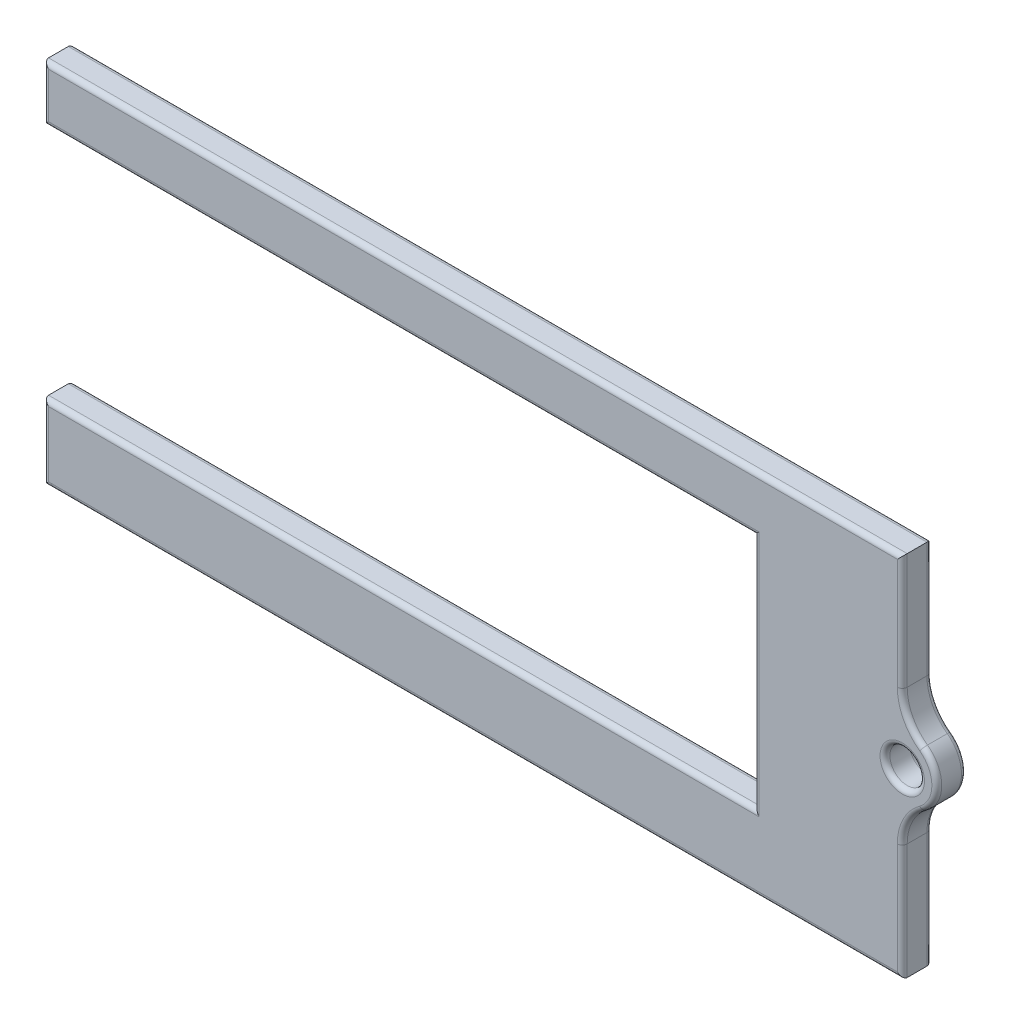
ISO-10303-21;
HEADER;
FILE_DESCRIPTION(('STEP AP214'),'2;1');
FILE_NAME('part.step','',(''),(''),'','','');
FILE_SCHEMA(('AUTOMOTIVE_DESIGN { 1 0 10303 214 1 1 1 1 }'));
ENDSEC;
DATA;
#1=APPLICATION_CONTEXT('core data for automotive mechanical design processes');
#2=APPLICATION_PROTOCOL_DEFINITION('international standard','automotive_design',2000,#1);
#3=PRODUCT_CONTEXT('',#1,'mechanical');
#4=PRODUCT('Part','Part','',(#3));
#5=PRODUCT_RELATED_PRODUCT_CATEGORY('part','',(#4));
#6=PRODUCT_DEFINITION_FORMATION('','',#4);
#7=PRODUCT_DEFINITION_CONTEXT('part definition',#1,'design');
#8=PRODUCT_DEFINITION('design','',#6,#7);
#9=PRODUCT_DEFINITION_SHAPE('','',#8);
#10=(LENGTH_UNIT() NAMED_UNIT(*) SI_UNIT(.MILLI.,.METRE.));
#11=(NAMED_UNIT(*) PLANE_ANGLE_UNIT() SI_UNIT($,.RADIAN.));
#12=(NAMED_UNIT(*) SI_UNIT($,.STERADIAN.) SOLID_ANGLE_UNIT());
#13=UNCERTAINTY_MEASURE_WITH_UNIT(LENGTH_MEASURE(1.E-05),#10,'distance_accuracy_value','');
#14=(GEOMETRIC_REPRESENTATION_CONTEXT(3) GLOBAL_UNCERTAINTY_ASSIGNED_CONTEXT((#13)) GLOBAL_UNIT_ASSIGNED_CONTEXT((#10,
#11,#12)) REPRESENTATION_CONTEXT('',''));
#15=CARTESIAN_POINT('',(0.,0.,0.));
#16=DIRECTION('',(0.,0.,1.));
#17=DIRECTION('',(1.,0.,0.));
#18=AXIS2_PLACEMENT_3D('',#15,#16,#17);
#19=CARTESIAN_POINT('',(-179.5,121.,3.));
#20=DIRECTION('',(0.,0.,1.));
#21=DIRECTION('',(1.,0.,0.));
#22=AXIS2_PLACEMENT_3D('',#19,#20,#21);
#23=PLANE('',#22);
#24=CARTESIAN_POINT('',(-179.5,121.,3.));
#25=DIRECTION('',(0.,0.,1.));
#26=DIRECTION('',(1.,0.,0.));
#27=AXIS2_PLACEMENT_3D('',#24,#25,#26);
#28=CIRCLE('',#27,2.25000000000001);
#29=CARTESIAN_POINT('',(-177.25,121.,3.));
#30=VERTEX_POINT('',#29);
#31=EDGE_CURVE('E11',#30,#30,#28,.F.);
#32=ORIENTED_EDGE('',*,*,#31,.T.);
#33=EDGE_LOOP('',(#32));
#34=FACE_BOUND('',#33,.T.);
#35=DIRECTION('',(0.,1.,0.));
#36=VECTOR('',#35,1.);
#37=CARTESIAN_POINT('',(-180.,114.126136457566,3.));
#38=LINE('',#37,#36);
#39=CARTESIAN_POINT('',(-180.,102.9,3.));
#40=VERTEX_POINT('',#39);
#41=CARTESIAN_POINT('',(-180.,114.126136457566,3.));
#42=VERTEX_POINT('',#41);
#43=EDGE_CURVE('E60',#40,#42,#38,.T.);
#44=ORIENTED_EDGE('',*,*,#43,.T.);
#45=CARTESIAN_POINT('',(-174.5,114.126136457566,3.));
#46=DIRECTION('',(0.,0.,1.));
#47=DIRECTION('',(1.,0.,0.));
#48=AXIS2_PLACEMENT_3D('',#45,#46,#47);
#49=CIRCLE('',#48,5.50000000000001);
#50=CARTESIAN_POINT('',(-177.735294117647,118.573930514435,3.));
#51=VERTEX_POINT('',#50);
#52=EDGE_CURVE('E52',#42,#51,#49,.F.);
#53=ORIENTED_EDGE('',*,*,#52,.T.);
#54=CARTESIAN_POINT('',(-179.5,121.,3.));
#55=DIRECTION('',(0.,0.,1.));
#56=DIRECTION('',(1.,0.,0.));
#57=AXIS2_PLACEMENT_3D('',#54,#55,#56);
#58=CIRCLE('',#57,2.99999999999999);
#59=CARTESIAN_POINT('',(-177.735294117647,123.426069485565,3.));
#60=VERTEX_POINT('',#59);
#61=EDGE_CURVE('E326',#51,#60,#58,.T.);
#62=ORIENTED_EDGE('',*,*,#61,.T.);
#63=CARTESIAN_POINT('',(-174.5,127.873863542434,3.));
#64=DIRECTION('',(0.,0.,1.));
#65=DIRECTION('',(1.,0.,0.));
#66=AXIS2_PLACEMENT_3D('',#63,#64,#65);
#67=CIRCLE('',#66,5.50000000000001);
#68=CARTESIAN_POINT('',(-180.,127.873863542434,3.));
#69=VERTEX_POINT('',#68);
#70=EDGE_CURVE('E329',#60,#69,#67,.F.);
#71=ORIENTED_EDGE('',*,*,#70,.T.);
#72=DIRECTION('',(0.,1.,0.));
#73=VECTOR('',#72,1.);
#74=CARTESIAN_POINT('',(-180.,139.6,3.));
#75=LINE('',#74,#73);
#76=CARTESIAN_POINT('',(-180.,139.1,3.));
#77=VERTEX_POINT('',#76);
#78=EDGE_CURVE('E332',#69,#77,#75,.T.);
#79=ORIENTED_EDGE('',*,*,#78,.T.);
#80=DIRECTION('',(-1.,0.,0.));
#81=VECTOR('',#80,1.);
#82=CARTESIAN_POINT('',(-266.5,139.1,3.));
#83=LINE('',#82,#81);
#84=CARTESIAN_POINT('',(-266.,139.1,3.));
#85=VERTEX_POINT('',#84);
#86=EDGE_CURVE('E335',#77,#85,#83,.T.);
#87=ORIENTED_EDGE('',*,*,#86,.T.);
#88=DIRECTION('',(0.,-1.,0.));
#89=VECTOR('',#88,1.);
#90=CARTESIAN_POINT('',(-266.,134.,3.));
#91=LINE('',#90,#89);
#92=CARTESIAN_POINT('',(-266.,134.5,3.));
#93=VERTEX_POINT('',#92);
#94=EDGE_CURVE('E338',#85,#93,#91,.T.);
#95=ORIENTED_EDGE('',*,*,#94,.T.);
#96=DIRECTION('',(1.,0.,0.));
#97=VECTOR('',#96,1.);
#98=CARTESIAN_POINT('',(-194.5,134.5,3.));
#99=LINE('',#98,#97);
#100=CARTESIAN_POINT('',(-194.,134.5,3.));
#101=VERTEX_POINT('',#100);
#102=EDGE_CURVE('E341',#93,#101,#99,.T.);
#103=ORIENTED_EDGE('',*,*,#102,.T.);
#104=DIRECTION('',(0.,-1.,0.));
#105=VECTOR('',#104,1.);
#106=CARTESIAN_POINT('',(-194.,110.,3.));
#107=LINE('',#106,#105);
#108=CARTESIAN_POINT('',(-194.,109.5,3.));
#109=VERTEX_POINT('',#108);
#110=EDGE_CURVE('E344',#101,#109,#107,.T.);
#111=ORIENTED_EDGE('',*,*,#110,.T.);
#112=DIRECTION('',(-1.,0.,0.));
#113=VECTOR('',#112,1.);
#114=CARTESIAN_POINT('',(-266.5,109.5,3.));
#115=LINE('',#114,#113);
#116=CARTESIAN_POINT('',(-266.,109.5,3.));
#117=VERTEX_POINT('',#116);
#118=EDGE_CURVE('E347',#109,#117,#115,.T.);
#119=ORIENTED_EDGE('',*,*,#118,.T.);
#120=DIRECTION('',(0.,-1.,0.));
#121=VECTOR('',#120,1.);
#122=CARTESIAN_POINT('',(-266.,102.4,3.));
#123=LINE('',#122,#121);
#124=CARTESIAN_POINT('',(-266.,102.9,3.));
#125=VERTEX_POINT('',#124);
#126=EDGE_CURVE('E350',#117,#125,#123,.T.);
#127=ORIENTED_EDGE('',*,*,#126,.T.);
#128=DIRECTION('',(1.,0.,0.));
#129=VECTOR('',#128,1.);
#130=CARTESIAN_POINT('',(-179.5,102.9,3.));
#131=LINE('',#130,#129);
#132=EDGE_CURVE('E65',#125,#40,#131,.T.);
#133=ORIENTED_EDGE('',*,*,#132,.T.);
#134=EDGE_LOOP('',(#44,#53,#62,#71,#79,#87,#95,#103,#111,#119,#127,#133));
#135=FACE_BOUND('',#134,.T.);
#136=ADVANCED_FACE('F42',(#34,#135),#23,.T.);
#137=CARTESIAN_POINT('',(-179.5,121.,0.));
#138=DIRECTION('',(0.,0.,1.));
#139=DIRECTION('',(1.,0.,0.));
#140=AXIS2_PLACEMENT_3D('',#137,#138,#139);
#141=PLANE('',#140);
#142=CARTESIAN_POINT('',(-179.5,121.,0.));
#143=DIRECTION('',(0.,0.,1.));
#144=DIRECTION('',(1.,0.,0.));
#145=AXIS2_PLACEMENT_3D('',#142,#143,#144);
#146=CIRCLE('',#145,2.25000000000001);
#147=CARTESIAN_POINT('',(-177.25,121.,0.));
#148=VERTEX_POINT('',#147);
#149=EDGE_CURVE('E236',#148,#148,#146,.T.);
#150=ORIENTED_EDGE('',*,*,#149,.T.);
#151=EDGE_LOOP('',(#150));
#152=FACE_BOUND('',#151,.T.);
#153=DIRECTION('',(0.,1.,0.));
#154=VECTOR('',#153,1.);
#155=CARTESIAN_POINT('',(-180.,121.,0.));
#156=LINE('',#155,#154);
#157=CARTESIAN_POINT('',(-180.,139.1,0.));
#158=VERTEX_POINT('',#157);
#159=CARTESIAN_POINT('',(-180.,127.873863542434,0.));
#160=VERTEX_POINT('',#159);
#161=EDGE_CURVE('E234',#158,#160,#156,.F.);
#162=ORIENTED_EDGE('',*,*,#161,.T.);
#163=CARTESIAN_POINT('',(-174.5,127.873863542434,0.));
#164=DIRECTION('',(0.,0.,1.));
#165=DIRECTION('',(1.,0.,0.));
#166=AXIS2_PLACEMENT_3D('',#163,#164,#165);
#167=CIRCLE('',#166,5.50000000000001);
#168=CARTESIAN_POINT('',(-177.735294117647,123.426069485565,0.));
#169=VERTEX_POINT('',#168);
#170=EDGE_CURVE('E211',#160,#169,#167,.T.);
#171=ORIENTED_EDGE('',*,*,#170,.T.);
#172=CARTESIAN_POINT('',(-179.5,121.,0.));
#173=DIRECTION('',(0.,0.,1.));
#174=DIRECTION('',(1.,0.,0.));
#175=AXIS2_PLACEMENT_3D('',#172,#173,#174);
#176=CIRCLE('',#175,2.99999999999999);
#177=CARTESIAN_POINT('',(-177.735294117647,118.573930514435,0.));
#178=VERTEX_POINT('',#177);
#179=EDGE_CURVE('E222',#169,#178,#176,.F.);
#180=ORIENTED_EDGE('',*,*,#179,.T.);
#181=CARTESIAN_POINT('',(-174.5,114.126136457566,0.));
#182=DIRECTION('',(0.,0.,1.));
#183=DIRECTION('',(1.,0.,0.));
#184=AXIS2_PLACEMENT_3D('',#181,#182,#183);
#185=CIRCLE('',#184,5.50000000000001);
#186=CARTESIAN_POINT('',(-180.,114.126136457566,0.));
#187=VERTEX_POINT('',#186);
#188=EDGE_CURVE('E229',#178,#187,#185,.T.);
#189=ORIENTED_EDGE('',*,*,#188,.T.);
#190=DIRECTION('',(0.,1.,0.));
#191=VECTOR('',#190,1.);
#192=CARTESIAN_POINT('',(-180.,121.,0.));
#193=LINE('',#192,#191);
#194=CARTESIAN_POINT('',(-180.,102.9,0.));
#195=VERTEX_POINT('',#194);
#196=EDGE_CURVE('E491',#187,#195,#193,.F.);
#197=ORIENTED_EDGE('',*,*,#196,.T.);
#198=DIRECTION('',(1.,0.,0.));
#199=VECTOR('',#198,1.);
#200=CARTESIAN_POINT('',(-179.5,102.9,0.));
#201=LINE('',#200,#199);
#202=CARTESIAN_POINT('',(-266.,102.9,0.));
#203=VERTEX_POINT('',#202);
#204=EDGE_CURVE('E494',#195,#203,#201,.F.);
#205=ORIENTED_EDGE('',*,*,#204,.T.);
#206=DIRECTION('',(0.,-1.,0.));
#207=VECTOR('',#206,1.);
#208=CARTESIAN_POINT('',(-266.,121.,0.));
#209=LINE('',#208,#207);
#210=CARTESIAN_POINT('',(-266.,109.5,0.));
#211=VERTEX_POINT('',#210);
#212=EDGE_CURVE('E497',#203,#211,#209,.F.);
#213=ORIENTED_EDGE('',*,*,#212,.T.);
#214=DIRECTION('',(-1.,0.,0.));
#215=VECTOR('',#214,1.);
#216=CARTESIAN_POINT('',(-179.5,109.5,0.));
#217=LINE('',#216,#215);
#218=CARTESIAN_POINT('',(-194.,109.5,0.));
#219=VERTEX_POINT('',#218);
#220=EDGE_CURVE('E500',#211,#219,#217,.F.);
#221=ORIENTED_EDGE('',*,*,#220,.T.);
#222=DIRECTION('',(0.,-1.,0.));
#223=VECTOR('',#222,1.);
#224=CARTESIAN_POINT('',(-194.,121.,0.));
#225=LINE('',#224,#223);
#226=CARTESIAN_POINT('',(-194.,134.5,0.));
#227=VERTEX_POINT('',#226);
#228=EDGE_CURVE('E503',#219,#227,#225,.F.);
#229=ORIENTED_EDGE('',*,*,#228,.T.);
#230=DIRECTION('',(1.,0.,0.));
#231=VECTOR('',#230,1.);
#232=CARTESIAN_POINT('',(-179.5,134.5,0.));
#233=LINE('',#232,#231);
#234=CARTESIAN_POINT('',(-266.,134.5,0.));
#235=VERTEX_POINT('',#234);
#236=EDGE_CURVE('E506',#227,#235,#233,.F.);
#237=ORIENTED_EDGE('',*,*,#236,.T.);
#238=DIRECTION('',(0.,-1.,0.));
#239=VECTOR('',#238,1.);
#240=CARTESIAN_POINT('',(-266.,121.,0.));
#241=LINE('',#240,#239);
#242=CARTESIAN_POINT('',(-266.,139.1,0.));
#243=VERTEX_POINT('',#242);
#244=EDGE_CURVE('E509',#235,#243,#241,.F.);
#245=ORIENTED_EDGE('',*,*,#244,.T.);
#246=DIRECTION('',(-1.,0.,0.));
#247=VECTOR('',#246,1.);
#248=CARTESIAN_POINT('',(-179.5,139.1,0.));
#249=LINE('',#248,#247);
#250=EDGE_CURVE('E243',#243,#158,#249,.F.);
#251=ORIENTED_EDGE('',*,*,#250,.T.);
#252=EDGE_LOOP('',(#162,#171,#180,#189,#197,#205,#213,#221,#229,#237,#245,#251));
#253=FACE_BOUND('',#252,.T.);
#254=ADVANCED_FACE('F232',(#152,#253),#141,.F.);
#255=CARTESIAN_POINT('',(-179.5,121.,3.));
#256=DIRECTION('',(0.,0.,-1.));
#257=DIRECTION('',(-1.,0.,0.));
#258=AXIS2_PLACEMENT_3D('',#255,#256,#257);
#259=CYLINDRICAL_SURFACE('',#258,3.49999999999999);
#260=DIRECTION('',(0.,0.,-1.));
#261=VECTOR('',#260,1.);
#262=CARTESIAN_POINT('',(-177.441176470588,118.169585600174,3.));
#263=LINE('',#262,#261);
#264=CARTESIAN_POINT('',(-177.441176470588,118.169585600174,2.5));
#265=VERTEX_POINT('',#264);
#266=CARTESIAN_POINT('',(-177.441176470588,118.169585600174,0.5));
#267=VERTEX_POINT('',#266);
#268=EDGE_CURVE('E398',#265,#267,#263,.T.);
#269=ORIENTED_EDGE('',*,*,#268,.T.);
#270=CARTESIAN_POINT('',(-179.5,121.,0.5));
#271=DIRECTION('',(0.,0.,1.));
#272=DIRECTION('',(1.,0.,0.));
#273=AXIS2_PLACEMENT_3D('',#270,#271,#272);
#274=CIRCLE('',#273,3.49999999999999);
#275=CARTESIAN_POINT('',(-177.441176470588,123.830414399826,0.5));
#276=VERTEX_POINT('',#275);
#277=EDGE_CURVE('E323',#267,#276,#274,.T.);
#278=ORIENTED_EDGE('',*,*,#277,.T.);
#279=DIRECTION('',(0.,0.,-1.));
#280=VECTOR('',#279,1.);
#281=CARTESIAN_POINT('',(-177.441176470588,123.830414399826,3.));
#282=LINE('',#281,#280);
#283=CARTESIAN_POINT('',(-177.441176470588,123.830414399826,2.5));
#284=VERTEX_POINT('',#283);
#285=EDGE_CURVE('E230',#284,#276,#282,.T.);
#286=ORIENTED_EDGE('',*,*,#285,.F.);
#287=CARTESIAN_POINT('',(-179.5,121.,2.5));
#288=DIRECTION('',(0.,0.,1.));
#289=DIRECTION('',(1.,0.,0.));
#290=AXIS2_PLACEMENT_3D('',#287,#288,#289);
#291=CIRCLE('',#290,3.49999999999999);
#292=EDGE_CURVE('E320',#284,#265,#291,.F.);
#293=ORIENTED_EDGE('',*,*,#292,.T.);
#294=EDGE_LOOP('',(#269,#278,#286,#293));
#295=FACE_BOUND('',#294,.T.);
#296=ADVANCED_FACE('F543',(#295),#259,.T.);
#297=CARTESIAN_POINT('',(-174.5,127.873863542434,3.));
#298=DIRECTION('',(0.,0.,-1.));
#299=DIRECTION('',(-1.,0.,0.));
#300=AXIS2_PLACEMENT_3D('',#297,#298,#299);
#301=CYLINDRICAL_SURFACE('',#300,5.00000000000001);
#302=ORIENTED_EDGE('',*,*,#285,.T.);
#303=CARTESIAN_POINT('',(-174.5,127.873863542434,0.5));
#304=DIRECTION('',(0.,0.,1.));
#305=DIRECTION('',(1.,0.,0.));
#306=AXIS2_PLACEMENT_3D('',#303,#304,#305);
#307=CIRCLE('',#306,5.00000000000001);
#308=CARTESIAN_POINT('',(-179.5,127.873863542434,0.5));
#309=VERTEX_POINT('',#308);
#310=EDGE_CURVE('E214',#276,#309,#307,.F.);
#311=ORIENTED_EDGE('',*,*,#310,.T.);
#312=DIRECTION('',(0.,0.,-1.));
#313=VECTOR('',#312,1.);
#314=CARTESIAN_POINT('',(-179.5,127.873863542434,3.));
#315=LINE('',#314,#313);
#316=CARTESIAN_POINT('',(-179.5,127.873863542434,2.5));
#317=VERTEX_POINT('',#316);
#318=EDGE_CURVE('E482',#317,#309,#315,.T.);
#319=ORIENTED_EDGE('',*,*,#318,.F.);
#320=CARTESIAN_POINT('',(-174.5,127.873863542434,2.5));
#321=DIRECTION('',(0.,0.,1.));
#322=DIRECTION('',(1.,0.,0.));
#323=AXIS2_PLACEMENT_3D('',#320,#321,#322);
#324=CIRCLE('',#323,5.00000000000001);
#325=EDGE_CURVE('E254',#317,#284,#324,.T.);
#326=ORIENTED_EDGE('',*,*,#325,.T.);
#327=EDGE_LOOP('',(#302,#311,#319,#326));
#328=FACE_BOUND('',#327,.T.);
#329=ADVANCED_FACE('F526',(#328),#301,.F.);
#330=CARTESIAN_POINT('',(-179.5,127.873863542434,3.));
#331=DIRECTION('',(-1.,0.,0.));
#332=DIRECTION('',(0.,0.,1.));
#333=AXIS2_PLACEMENT_3D('',#330,#331,#332);
#334=PLANE('',#333);
#335=ORIENTED_EDGE('',*,*,#318,.T.);
#336=DIRECTION('',(0.,1.,0.));
#337=VECTOR('',#336,1.);
#338=CARTESIAN_POINT('',(-179.5,127.873863542434,0.5));
#339=LINE('',#338,#337);
#340=CARTESIAN_POINT('',(-179.5,139.6,0.5));
#341=VERTEX_POINT('',#340);
#342=EDGE_CURVE('E262',#309,#341,#339,.T.);
#343=ORIENTED_EDGE('',*,*,#342,.T.);
#344=DIRECTION('',(0.,0.,-1.));
#345=VECTOR('',#344,1.);
#346=CARTESIAN_POINT('',(-179.5,139.6,3.));
#347=LINE('',#346,#345);
#348=CARTESIAN_POINT('',(-179.5,139.6,2.5));
#349=VERTEX_POINT('',#348);
#350=EDGE_CURVE('E473',#349,#341,#347,.T.);
#351=ORIENTED_EDGE('',*,*,#350,.F.);
#352=DIRECTION('',(0.,1.,0.));
#353=VECTOR('',#352,1.);
#354=CARTESIAN_POINT('',(-179.5,127.873863542434,2.5));
#355=LINE('',#354,#353);
#356=EDGE_CURVE('E259',#349,#317,#355,.F.);
#357=ORIENTED_EDGE('',*,*,#356,.T.);
#358=EDGE_LOOP('',(#335,#343,#351,#357));
#359=FACE_BOUND('',#358,.T.);
#360=ADVANCED_FACE('F529',(#359),#334,.F.);
#361=CARTESIAN_POINT('',(-266.5,139.6,3.));
#362=DIRECTION('',(0.,-1.,0.));
#363=DIRECTION('',(0.,0.,-1.));
#364=AXIS2_PLACEMENT_3D('',#361,#362,#363);
#365=PLANE('',#364);
#366=ORIENTED_EDGE('',*,*,#350,.T.);
#367=DIRECTION('',(-1.,0.,0.));
#368=VECTOR('',#367,1.);
#369=CARTESIAN_POINT('',(-266.5,139.6,0.5));
#370=LINE('',#369,#368);
#371=CARTESIAN_POINT('',(-266.5,139.6,0.5));
#372=VERTEX_POINT('',#371);
#373=EDGE_CURVE('E268',#341,#372,#370,.T.);
#374=ORIENTED_EDGE('',*,*,#373,.T.);
#375=DIRECTION('',(0.,0.,-1.));
#376=VECTOR('',#375,1.);
#377=CARTESIAN_POINT('',(-266.5,139.6,3.));
#378=LINE('',#377,#376);
#379=CARTESIAN_POINT('',(-266.5,139.6,2.5));
#380=VERTEX_POINT('',#379);
#381=EDGE_CURVE('E469',#380,#372,#378,.T.);
#382=ORIENTED_EDGE('',*,*,#381,.F.);
#383=DIRECTION('',(-1.,0.,0.));
#384=VECTOR('',#383,1.);
#385=CARTESIAN_POINT('',(-179.5,139.6,2.5));
#386=LINE('',#385,#384);
#387=EDGE_CURVE('E265',#380,#349,#386,.F.);
#388=ORIENTED_EDGE('',*,*,#387,.T.);
#389=EDGE_LOOP('',(#366,#374,#382,#388));
#390=FACE_BOUND('',#389,.T.);
#391=ADVANCED_FACE('F631',(#390),#365,.F.);
#392=CARTESIAN_POINT('',(-266.5,139.6,3.));
#393=DIRECTION('',(1.,0.,0.));
#394=DIRECTION('',(0.,0.,-1.));
#395=AXIS2_PLACEMENT_3D('',#392,#393,#394);
#396=PLANE('',#395);
#397=ORIENTED_EDGE('',*,*,#381,.T.);
#398=DIRECTION('',(0.,-1.,0.));
#399=VECTOR('',#398,1.);
#400=CARTESIAN_POINT('',(-266.5,139.6,0.5));
#401=LINE('',#400,#399);
#402=CARTESIAN_POINT('',(-266.5,134.,0.5));
#403=VERTEX_POINT('',#402);
#404=EDGE_CURVE('E274',#372,#403,#401,.T.);
#405=ORIENTED_EDGE('',*,*,#404,.T.);
#406=DIRECTION('',(0.,0.,-1.));
#407=VECTOR('',#406,1.);
#408=CARTESIAN_POINT('',(-266.5,134.,3.));
#409=LINE('',#408,#407);
#410=CARTESIAN_POINT('',(-266.5,134.,2.5));
#411=VERTEX_POINT('',#410);
#412=EDGE_CURVE('E459',#411,#403,#409,.T.);
#413=ORIENTED_EDGE('',*,*,#412,.F.);
#414=DIRECTION('',(0.,-1.,0.));
#415=VECTOR('',#414,1.);
#416=CARTESIAN_POINT('',(-266.5,139.6,2.5));
#417=LINE('',#416,#415);
#418=EDGE_CURVE('E271',#411,#380,#417,.F.);
#419=ORIENTED_EDGE('',*,*,#418,.T.);
#420=EDGE_LOOP('',(#397,#405,#413,#419));
#421=FACE_BOUND('',#420,.T.);
#422=ADVANCED_FACE('F465',(#421),#396,.F.);
#423=CARTESIAN_POINT('',(-266.5,134.,3.));
#424=DIRECTION('',(0.,1.,0.));
#425=DIRECTION('',(0.,0.,1.));
#426=AXIS2_PLACEMENT_3D('',#423,#424,#425);
#427=PLANE('',#426);
#428=ORIENTED_EDGE('',*,*,#412,.T.);
#429=DIRECTION('',(1.,0.,0.));
#430=VECTOR('',#429,1.);
#431=CARTESIAN_POINT('',(-266.5,134.,0.5));
#432=LINE('',#431,#430);
#433=CARTESIAN_POINT('',(-194.5,134.,0.5));
#434=VERTEX_POINT('',#433);
#435=EDGE_CURVE('E280',#403,#434,#432,.T.);
#436=ORIENTED_EDGE('',*,*,#435,.T.);
#437=DIRECTION('',(0.,0.,-1.));
#438=VECTOR('',#437,1.);
#439=CARTESIAN_POINT('',(-194.5,134.,3.));
#440=LINE('',#439,#438);
#441=CARTESIAN_POINT('',(-194.5,134.,2.5));
#442=VERTEX_POINT('',#441);
#443=EDGE_CURVE('E462',#442,#434,#440,.T.);
#444=ORIENTED_EDGE('',*,*,#443,.F.);
#445=DIRECTION('',(1.,0.,0.));
#446=VECTOR('',#445,1.);
#447=CARTESIAN_POINT('',(-266.5,134.,2.5));
#448=LINE('',#447,#446);
#449=EDGE_CURVE('E277',#442,#411,#448,.F.);
#450=ORIENTED_EDGE('',*,*,#449,.T.);
#451=EDGE_LOOP('',(#428,#436,#444,#450));
#452=FACE_BOUND('',#451,.T.);
#453=ADVANCED_FACE('F458',(#452),#427,.F.);
#454=CARTESIAN_POINT('',(-194.5,134.,3.));
#455=DIRECTION('',(1.,0.,0.));
#456=DIRECTION('',(0.,0.,-1.));
#457=AXIS2_PLACEMENT_3D('',#454,#455,#456);
#458=PLANE('',#457);
#459=ORIENTED_EDGE('',*,*,#443,.T.);
#460=DIRECTION('',(0.,-1.,0.));
#461=VECTOR('',#460,1.);
#462=CARTESIAN_POINT('',(-194.5,134.,0.5));
#463=LINE('',#462,#461);
#464=CARTESIAN_POINT('',(-194.5,110.,0.5));
#465=VERTEX_POINT('',#464);
#466=EDGE_CURVE('E286',#434,#465,#463,.T.);
#467=ORIENTED_EDGE('',*,*,#466,.T.);
#468=DIRECTION('',(0.,0.,-1.));
#469=VECTOR('',#468,1.);
#470=CARTESIAN_POINT('',(-194.5,110.,3.));
#471=LINE('',#470,#469);
#472=CARTESIAN_POINT('',(-194.5,110.,2.5));
#473=VERTEX_POINT('',#472);
#474=EDGE_CURVE('E475',#473,#465,#471,.T.);
#475=ORIENTED_EDGE('',*,*,#474,.F.);
#476=DIRECTION('',(0.,-1.,0.));
#477=VECTOR('',#476,1.);
#478=CARTESIAN_POINT('',(-194.5,134.,2.5));
#479=LINE('',#478,#477);
#480=EDGE_CURVE('E283',#473,#442,#479,.F.);
#481=ORIENTED_EDGE('',*,*,#480,.T.);
#482=EDGE_LOOP('',(#459,#467,#475,#481));
#483=FACE_BOUND('',#482,.T.);
#484=ADVANCED_FACE('F622',(#483),#458,.F.);
#485=CARTESIAN_POINT('',(-194.5,110.,3.));
#486=DIRECTION('',(0.,-1.,0.));
#487=DIRECTION('',(0.,0.,-1.));
#488=AXIS2_PLACEMENT_3D('',#485,#486,#487);
#489=PLANE('',#488);
#490=ORIENTED_EDGE('',*,*,#474,.T.);
#491=DIRECTION('',(-1.,0.,0.));
#492=VECTOR('',#491,1.);
#493=CARTESIAN_POINT('',(-194.5,110.,0.5));
#494=LINE('',#493,#492);
#495=CARTESIAN_POINT('',(-266.5,110.,0.5));
#496=VERTEX_POINT('',#495);
#497=EDGE_CURVE('E292',#465,#496,#494,.T.);
#498=ORIENTED_EDGE('',*,*,#497,.T.);
#499=DIRECTION('',(0.,0.,-1.));
#500=VECTOR('',#499,1.);
#501=CARTESIAN_POINT('',(-266.5,110.,3.));
#502=LINE('',#501,#500);
#503=CARTESIAN_POINT('',(-266.5,110.,2.5));
#504=VERTEX_POINT('',#503);
#505=EDGE_CURVE('E1052',#504,#496,#502,.T.);
#506=ORIENTED_EDGE('',*,*,#505,.F.);
#507=DIRECTION('',(-1.,0.,0.));
#508=VECTOR('',#507,1.);
#509=CARTESIAN_POINT('',(-194.5,110.,2.5));
#510=LINE('',#509,#508);
#511=EDGE_CURVE('E289',#504,#473,#510,.F.);
#512=ORIENTED_EDGE('',*,*,#511,.T.);
#513=EDGE_LOOP('',(#490,#498,#506,#512));
#514=FACE_BOUND('',#513,.T.);
#515=ADVANCED_FACE('F618',(#514),#489,.F.);
#516=CARTESIAN_POINT('',(-266.5,110.,3.));
#517=DIRECTION('',(1.,0.,0.));
#518=DIRECTION('',(0.,0.,-1.));
#519=AXIS2_PLACEMENT_3D('',#516,#517,#518);
#520=PLANE('',#519);
#521=ORIENTED_EDGE('',*,*,#505,.T.);
#522=DIRECTION('',(0.,-1.,0.));
#523=VECTOR('',#522,1.);
#524=CARTESIAN_POINT('',(-266.5,110.,0.5));
#525=LINE('',#524,#523);
#526=CARTESIAN_POINT('',(-266.5,102.4,0.5));
#527=VERTEX_POINT('',#526);
#528=EDGE_CURVE('E298',#496,#527,#525,.T.);
#529=ORIENTED_EDGE('',*,*,#528,.T.);
#530=DIRECTION('',(0.,0.,-1.));
#531=VECTOR('',#530,1.);
#532=CARTESIAN_POINT('',(-266.5,102.4,3.));
#533=LINE('',#532,#531);
#534=CARTESIAN_POINT('',(-266.5,102.4,2.5));
#535=VERTEX_POINT('',#534);
#536=EDGE_CURVE('E1046',#535,#527,#533,.T.);
#537=ORIENTED_EDGE('',*,*,#536,.F.);
#538=DIRECTION('',(0.,-1.,0.));
#539=VECTOR('',#538,1.);
#540=CARTESIAN_POINT('',(-266.5,110.,2.5));
#541=LINE('',#540,#539);
#542=EDGE_CURVE('E295',#535,#504,#541,.F.);
#543=ORIENTED_EDGE('',*,*,#542,.T.);
#544=EDGE_LOOP('',(#521,#529,#537,#543));
#545=FACE_BOUND('',#544,.T.);
#546=ADVANCED_FACE('F614',(#545),#520,.F.);
#547=CARTESIAN_POINT('',(-266.5,102.4,3.));
#548=DIRECTION('',(0.,1.,0.));
#549=DIRECTION('',(0.,0.,1.));
#550=AXIS2_PLACEMENT_3D('',#547,#548,#549);
#551=PLANE('',#550);
#552=ORIENTED_EDGE('',*,*,#536,.T.);
#553=DIRECTION('',(1.,0.,0.));
#554=VECTOR('',#553,1.);
#555=CARTESIAN_POINT('',(-266.5,102.4,0.5));
#556=LINE('',#555,#554);
#557=CARTESIAN_POINT('',(-179.5,102.4,0.5));
#558=VERTEX_POINT('',#557);
#559=EDGE_CURVE('E304',#527,#558,#556,.T.);
#560=ORIENTED_EDGE('',*,*,#559,.T.);
#561=DIRECTION('',(0.,0.,-1.));
#562=VECTOR('',#561,1.);
#563=CARTESIAN_POINT('',(-179.5,102.4,3.));
#564=LINE('',#563,#562);
#565=CARTESIAN_POINT('',(-179.5,102.4,2.5));
#566=VERTEX_POINT('',#565);
#567=EDGE_CURVE('E1043',#566,#558,#564,.T.);
#568=ORIENTED_EDGE('',*,*,#567,.F.);
#569=DIRECTION('',(1.,0.,0.));
#570=VECTOR('',#569,1.);
#571=CARTESIAN_POINT('',(-266.5,102.4,2.5));
#572=LINE('',#571,#570);
#573=EDGE_CURVE('E301',#566,#535,#572,.F.);
#574=ORIENTED_EDGE('',*,*,#573,.T.);
#575=EDGE_LOOP('',(#552,#560,#568,#574));
#576=FACE_BOUND('',#575,.T.);
#577=ADVANCED_FACE('F610',(#576),#551,.F.);
#578=CARTESIAN_POINT('',(-179.5,102.4,3.));
#579=DIRECTION('',(-1.,0.,0.));
#580=DIRECTION('',(0.,0.,1.));
#581=AXIS2_PLACEMENT_3D('',#578,#579,#580);
#582=PLANE('',#581);
#583=ORIENTED_EDGE('',*,*,#567,.T.);
#584=DIRECTION('',(0.,1.,0.));
#585=VECTOR('',#584,1.);
#586=CARTESIAN_POINT('',(-179.5,102.4,0.5));
#587=LINE('',#586,#585);
#588=CARTESIAN_POINT('',(-179.5,114.126136457566,0.5));
#589=VERTEX_POINT('',#588);
#590=EDGE_CURVE('E310',#558,#589,#587,.T.);
#591=ORIENTED_EDGE('',*,*,#590,.T.);
#592=DIRECTION('',(0.,0.,-1.));
#593=VECTOR('',#592,1.);
#594=CARTESIAN_POINT('',(-179.5,114.126136457566,3.));
#595=LINE('',#594,#593);
#596=CARTESIAN_POINT('',(-179.5,114.126136457566,2.5));
#597=VERTEX_POINT('',#596);
#598=EDGE_CURVE('E548',#597,#589,#595,.T.);
#599=ORIENTED_EDGE('',*,*,#598,.F.);
#600=DIRECTION('',(0.,1.,0.));
#601=VECTOR('',#600,1.);
#602=CARTESIAN_POINT('',(-179.5,102.4,2.5));
#603=LINE('',#602,#601);
#604=EDGE_CURVE('E307',#597,#566,#603,.F.);
#605=ORIENTED_EDGE('',*,*,#604,.T.);
#606=EDGE_LOOP('',(#583,#591,#599,#605));
#607=FACE_BOUND('',#606,.T.);
#608=ADVANCED_FACE('F607',(#607),#582,.F.);
#609=CARTESIAN_POINT('',(-174.5,114.126136457566,3.));
#610=DIRECTION('',(0.,0.,-1.));
#611=DIRECTION('',(-1.,0.,0.));
#612=AXIS2_PLACEMENT_3D('',#609,#610,#611);
#613=CYLINDRICAL_SURFACE('',#612,5.00000000000001);
#614=ORIENTED_EDGE('',*,*,#598,.T.);
#615=CARTESIAN_POINT('',(-174.5,114.126136457566,0.5));
#616=DIRECTION('',(0.,0.,1.));
#617=DIRECTION('',(1.,0.,0.));
#618=AXIS2_PLACEMENT_3D('',#615,#616,#617);
#619=CIRCLE('',#618,5.00000000000001);
#620=EDGE_CURVE('E317',#589,#267,#619,.F.);
#621=ORIENTED_EDGE('',*,*,#620,.T.);
#622=ORIENTED_EDGE('',*,*,#268,.F.);
#623=CARTESIAN_POINT('',(-174.5,114.126136457566,2.5));
#624=DIRECTION('',(0.,0.,1.));
#625=DIRECTION('',(1.,0.,0.));
#626=AXIS2_PLACEMENT_3D('',#623,#624,#625);
#627=CIRCLE('',#626,5.00000000000001);
#628=EDGE_CURVE('E313',#265,#597,#627,.T.);
#629=ORIENTED_EDGE('',*,*,#628,.T.);
#630=EDGE_LOOP('',(#614,#621,#622,#629));
#631=FACE_BOUND('',#630,.T.);
#632=ADVANCED_FACE('F604',(#631),#613,.F.);
#633=CARTESIAN_POINT('',(-179.5,121.,3.));
#634=DIRECTION('',(0.,0.,-1.));
#635=DIRECTION('',(-1.,0.,0.));
#636=AXIS2_PLACEMENT_3D('',#633,#634,#635);
#637=CYLINDRICAL_SURFACE('',#636,1.75000000000001);
#638=CARTESIAN_POINT('',(-179.5,121.,0.5));
#639=DIRECTION('',(0.,0.,1.));
#640=DIRECTION('',(1.,0.,0.));
#641=AXIS2_PLACEMENT_3D('',#638,#639,#640);
#642=CIRCLE('',#641,1.75000000000001);
#643=CARTESIAN_POINT('',(-177.75,121.,0.5));
#644=VERTEX_POINT('',#643);
#645=EDGE_CURVE('E250',#644,#644,#642,.F.);
#646=ORIENTED_EDGE('',*,*,#645,.T.);
#647=EDGE_LOOP('',(#646));
#648=FACE_BOUND('',#647,.T.);
#649=CARTESIAN_POINT('',(-179.5,121.,2.5));
#650=DIRECTION('',(0.,0.,1.));
#651=DIRECTION('',(1.,0.,0.));
#652=AXIS2_PLACEMENT_3D('',#649,#650,#651);
#653=CIRCLE('',#652,1.75000000000001);
#654=CARTESIAN_POINT('',(-177.75,121.,2.5));
#655=VERTEX_POINT('',#654);
#656=EDGE_CURVE('E241',#655,#655,#653,.T.);
#657=ORIENTED_EDGE('',*,*,#656,.T.);
#658=EDGE_LOOP('',(#657));
#659=FACE_BOUND('',#658,.T.);
#660=ADVANCED_FACE('F602',(#648,#659),#637,.F.);
#661=CARTESIAN_POINT('',(-179.5,121.,0.5));
#662=DIRECTION('',(0.,0.,1.));
#663=DIRECTION('',(1.,0.,0.));
#664=AXIS2_PLACEMENT_3D('',#661,#662,#663);
#665=TOROIDAL_SURFACE('',#664,2.25000000000001,0.5);
#666=ORIENTED_EDGE('',*,*,#645,.F.);
#667=EDGE_LOOP('',(#666));
#668=FACE_BOUND('',#667,.T.);
#669=ORIENTED_EDGE('',*,*,#149,.F.);
#670=EDGE_LOOP('',(#669));
#671=FACE_BOUND('',#670,.T.);
#672=ADVANCED_FACE('F641',(#668,#671),#665,.T.);
#673=CARTESIAN_POINT('',(-194.5,109.5,0.5));
#674=DIRECTION('',(-1.,0.,0.));
#675=DIRECTION('',(0.,0.,1.));
#676=AXIS2_PLACEMENT_3D('',#673,#674,#675);
#677=CYLINDRICAL_SURFACE('',#676,0.5);
#678=CARTESIAN_POINT('',(-194.,109.5,0.5));
#679=DIRECTION('',(-0.707106781186547,-0.707106781186547,0.));
#680=DIRECTION('',(0.707106781186547,-0.707106781186547,0.));
#681=AXIS2_PLACEMENT_3D('',#678,#679,#680);
#682=ELLIPSE('',#681,0.707106781186547,0.5);
#683=EDGE_CURVE('E390',#219,#465,#682,.F.);
#684=ORIENTED_EDGE('',*,*,#683,.F.);
#685=ORIENTED_EDGE('',*,*,#220,.F.);
#686=CARTESIAN_POINT('',(-266.,109.5,0.5));
#687=DIRECTION('',(-0.707106781186547,-0.707106781186547,0.));
#688=DIRECTION('',(0.707106781186547,-0.707106781186547,0.));
#689=AXIS2_PLACEMENT_3D('',#686,#687,#688);
#690=ELLIPSE('',#689,0.707106781186547,0.5);
#691=EDGE_CURVE('E394',#496,#211,#690,.T.);
#692=ORIENTED_EDGE('',*,*,#691,.F.);
#693=ORIENTED_EDGE('',*,*,#497,.F.);
#694=EDGE_LOOP('',(#684,#685,#692,#693));
#695=FACE_BOUND('',#694,.T.);
#696=ADVANCED_FACE('F573',(#695),#677,.T.);
#697=CARTESIAN_POINT('',(-266.,110.,0.5));
#698=DIRECTION('',(0.,-1.,0.));
#699=DIRECTION('',(0.,0.,-1.));
#700=AXIS2_PLACEMENT_3D('',#697,#698,#699);
#701=CYLINDRICAL_SURFACE('',#700,0.5);
#702=ORIENTED_EDGE('',*,*,#691,.T.);
#703=ORIENTED_EDGE('',*,*,#212,.F.);
#704=CARTESIAN_POINT('',(-266.,102.9,0.5));
#705=DIRECTION('',(0.707106781186547,-0.707106781186547,0.));
#706=DIRECTION('',(0.707106781186547,0.707106781186547,0.));
#707=AXIS2_PLACEMENT_3D('',#704,#705,#706);
#708=ELLIPSE('',#707,0.707106781186547,0.5);
#709=EDGE_CURVE('E386',#527,#203,#708,.T.);
#710=ORIENTED_EDGE('',*,*,#709,.F.);
#711=ORIENTED_EDGE('',*,*,#528,.F.);
#712=EDGE_LOOP('',(#702,#703,#710,#711));
#713=FACE_BOUND('',#712,.T.);
#714=ADVANCED_FACE('F567',(#713),#701,.T.);
#715=CARTESIAN_POINT('',(-194.,134.,0.5));
#716=DIRECTION('',(0.,-1.,0.));
#717=DIRECTION('',(0.,0.,-1.));
#718=AXIS2_PLACEMENT_3D('',#715,#716,#717);
#719=CYLINDRICAL_SURFACE('',#718,0.5);
#720=ORIENTED_EDGE('',*,*,#683,.T.);
#721=ORIENTED_EDGE('',*,*,#466,.F.);
#722=CARTESIAN_POINT('',(-194.,134.5,0.5));
#723=DIRECTION('',(0.707106781186547,-0.707106781186547,0.));
#724=DIRECTION('',(0.707106781186547,0.707106781186547,0.));
#725=AXIS2_PLACEMENT_3D('',#722,#723,#724);
#726=ELLIPSE('',#725,0.707106781186547,0.5);
#727=EDGE_CURVE('E382',#227,#434,#726,.F.);
#728=ORIENTED_EDGE('',*,*,#727,.F.);
#729=ORIENTED_EDGE('',*,*,#228,.F.);
#730=EDGE_LOOP('',(#720,#721,#728,#729));
#731=FACE_BOUND('',#730,.T.);
#732=ADVANCED_FACE('F580',(#731),#719,.T.);
#733=CARTESIAN_POINT('',(-266.5,102.9,0.5));
#734=DIRECTION('',(1.,0.,0.));
#735=DIRECTION('',(0.,0.,-1.));
#736=AXIS2_PLACEMENT_3D('',#733,#734,#735);
#737=CYLINDRICAL_SURFACE('',#736,0.5);
#738=ORIENTED_EDGE('',*,*,#709,.T.);
#739=ORIENTED_EDGE('',*,*,#204,.F.);
#740=CARTESIAN_POINT('',(-180.,102.9,0.5));
#741=DIRECTION('',(0.707106781186547,0.707106781186547,0.));
#742=DIRECTION('',(-0.707106781186547,0.707106781186547,0.));
#743=AXIS2_PLACEMENT_3D('',#740,#741,#742);
#744=ELLIPSE('',#743,0.707106781186547,0.5);
#745=EDGE_CURVE('E378',#558,#195,#744,.T.);
#746=ORIENTED_EDGE('',*,*,#745,.F.);
#747=ORIENTED_EDGE('',*,*,#559,.F.);
#748=EDGE_LOOP('',(#738,#739,#746,#747));
#749=FACE_BOUND('',#748,.T.);
#750=ADVANCED_FACE('F562',(#749),#737,.T.);
#751=CARTESIAN_POINT('',(-266.5,134.5,0.5));
#752=DIRECTION('',(1.,0.,0.));
#753=DIRECTION('',(0.,0.,-1.));
#754=AXIS2_PLACEMENT_3D('',#751,#752,#753);
#755=CYLINDRICAL_SURFACE('',#754,0.5);
#756=ORIENTED_EDGE('',*,*,#727,.T.);
#757=ORIENTED_EDGE('',*,*,#435,.F.);
#758=CARTESIAN_POINT('',(-266.,134.5,0.5));
#759=DIRECTION('',(0.707106781186547,-0.707106781186547,0.));
#760=DIRECTION('',(0.707106781186547,0.707106781186547,0.));
#761=AXIS2_PLACEMENT_3D('',#758,#759,#760);
#762=ELLIPSE('',#761,0.707106781186547,0.5);
#763=EDGE_CURVE('E374',#235,#403,#762,.F.);
#764=ORIENTED_EDGE('',*,*,#763,.F.);
#765=ORIENTED_EDGE('',*,*,#236,.F.);
#766=EDGE_LOOP('',(#756,#757,#764,#765));
#767=FACE_BOUND('',#766,.T.);
#768=ADVANCED_FACE('F582',(#767),#755,.T.);
#769=CARTESIAN_POINT('',(-180.,102.4,0.5));
#770=DIRECTION('',(0.,1.,0.));
#771=DIRECTION('',(0.,0.,1.));
#772=AXIS2_PLACEMENT_3D('',#769,#770,#771);
#773=CYLINDRICAL_SURFACE('',#772,0.5);
#774=ORIENTED_EDGE('',*,*,#745,.T.);
#775=ORIENTED_EDGE('',*,*,#196,.F.);
#776=CARTESIAN_POINT('',(-180.,114.126136457566,0.5));
#777=DIRECTION('',(0.,1.,0.));
#778=DIRECTION('',(0.,0.,1.));
#779=AXIS2_PLACEMENT_3D('',#776,#777,#778);
#780=CIRCLE('',#779,0.5);
#781=EDGE_CURVE('E370',#589,#187,#780,.T.);
#782=ORIENTED_EDGE('',*,*,#781,.F.);
#783=ORIENTED_EDGE('',*,*,#590,.F.);
#784=EDGE_LOOP('',(#774,#775,#782,#783));
#785=FACE_BOUND('',#784,.T.);
#786=ADVANCED_FACE('F557',(#785),#773,.T.);
#787=CARTESIAN_POINT('',(-266.,139.6,0.5));
#788=DIRECTION('',(0.,-1.,0.));
#789=DIRECTION('',(0.,0.,-1.));
#790=AXIS2_PLACEMENT_3D('',#787,#788,#789);
#791=CYLINDRICAL_SURFACE('',#790,0.5);
#792=ORIENTED_EDGE('',*,*,#763,.T.);
#793=ORIENTED_EDGE('',*,*,#404,.F.);
#794=CARTESIAN_POINT('',(-266.,139.1,0.5));
#795=DIRECTION('',(-0.707106781186547,-0.707106781186547,0.));
#796=DIRECTION('',(0.707106781186547,-0.707106781186547,0.));
#797=AXIS2_PLACEMENT_3D('',#794,#795,#796);
#798=ELLIPSE('',#797,0.707106781186547,0.5);
#799=EDGE_CURVE('E366',#243,#372,#798,.F.);
#800=ORIENTED_EDGE('',*,*,#799,.F.);
#801=ORIENTED_EDGE('',*,*,#244,.F.);
#802=EDGE_LOOP('',(#792,#793,#800,#801));
#803=FACE_BOUND('',#802,.T.);
#804=ADVANCED_FACE('F584',(#803),#791,.T.);
#805=CARTESIAN_POINT('',(-174.5,114.126136457566,0.5));
#806=DIRECTION('',(0.,0.,1.));
#807=DIRECTION('',(1.,0.,0.));
#808=AXIS2_PLACEMENT_3D('',#805,#806,#807);
#809=TOROIDAL_SURFACE('',#808,5.50000000000001,0.5);
#810=ORIENTED_EDGE('',*,*,#781,.T.);
#811=ORIENTED_EDGE('',*,*,#188,.F.);
#812=CARTESIAN_POINT('',(-177.735294117647,118.573930514435,0.5));
#813=DIRECTION('',(0.808689828521607,0.588235294117663,0.));
#814=DIRECTION('',(-0.588235294117663,0.808689828521608,0.));
#815=AXIS2_PLACEMENT_3D('',#812,#813,#814);
#816=CIRCLE('',#815,0.5);
#817=EDGE_CURVE('E225',#267,#178,#816,.T.);
#818=ORIENTED_EDGE('',*,*,#817,.F.);
#819=ORIENTED_EDGE('',*,*,#620,.F.);
#820=EDGE_LOOP('',(#810,#811,#818,#819));
#821=FACE_BOUND('',#820,.T.);
#822=ADVANCED_FACE('F552',(#821),#809,.T.);
#823=CARTESIAN_POINT('',(-266.5,139.1,0.5));
#824=DIRECTION('',(-1.,0.,0.));
#825=DIRECTION('',(0.,0.,1.));
#826=AXIS2_PLACEMENT_3D('',#823,#824,#825);
#827=CYLINDRICAL_SURFACE('',#826,0.5);
#828=ORIENTED_EDGE('',*,*,#799,.T.);
#829=ORIENTED_EDGE('',*,*,#373,.F.);
#830=CARTESIAN_POINT('',(-180.,139.1,0.5));
#831=DIRECTION('',(-0.707106781186547,0.707106781186547,0.));
#832=DIRECTION('',(-0.707106781186547,-0.707106781186547,0.));
#833=AXIS2_PLACEMENT_3D('',#830,#831,#832);
#834=ELLIPSE('',#833,0.707106781186547,0.5);
#835=EDGE_CURVE('E218',#158,#341,#834,.F.);
#836=ORIENTED_EDGE('',*,*,#835,.F.);
#837=ORIENTED_EDGE('',*,*,#250,.F.);
#838=EDGE_LOOP('',(#828,#829,#836,#837));
#839=FACE_BOUND('',#838,.T.);
#840=ADVANCED_FACE('F518',(#839),#827,.T.);
#841=CARTESIAN_POINT('',(-179.5,121.,0.5));
#842=DIRECTION('',(0.,0.,1.));
#843=DIRECTION('',(1.,0.,0.));
#844=AXIS2_PLACEMENT_3D('',#841,#842,#843);
#845=TOROIDAL_SURFACE('',#844,2.99999999999999,0.5);
#846=ORIENTED_EDGE('',*,*,#817,.T.);
#847=ORIENTED_EDGE('',*,*,#179,.F.);
#848=CARTESIAN_POINT('',(-177.735294117647,123.426069485565,0.5));
#849=DIRECTION('',(-0.808689828521607,0.588235294117663,0.));
#850=DIRECTION('',(-0.588235294117663,-0.808689828521608,0.));
#851=AXIS2_PLACEMENT_3D('',#848,#849,#850);
#852=CIRCLE('',#851,0.5);
#853=EDGE_CURVE('E207',#276,#169,#852,.T.);
#854=ORIENTED_EDGE('',*,*,#853,.F.);
#855=ORIENTED_EDGE('',*,*,#277,.F.);
#856=EDGE_LOOP('',(#846,#847,#854,#855));
#857=FACE_BOUND('',#856,.T.);
#858=ADVANCED_FACE('F223',(#857),#845,.T.);
#859=CARTESIAN_POINT('',(-180.,127.873863542434,0.5));
#860=DIRECTION('',(0.,1.,0.));
#861=DIRECTION('',(0.,0.,1.));
#862=AXIS2_PLACEMENT_3D('',#859,#860,#861);
#863=CYLINDRICAL_SURFACE('',#862,0.5);
#864=ORIENTED_EDGE('',*,*,#835,.T.);
#865=ORIENTED_EDGE('',*,*,#342,.F.);
#866=CARTESIAN_POINT('',(-180.,127.873863542434,0.5));
#867=DIRECTION('',(0.,-1.,0.));
#868=DIRECTION('',(0.,0.,-1.));
#869=AXIS2_PLACEMENT_3D('',#866,#867,#868);
#870=CIRCLE('',#869,0.5);
#871=EDGE_CURVE('E219',#160,#309,#870,.T.);
#872=ORIENTED_EDGE('',*,*,#871,.F.);
#873=ORIENTED_EDGE('',*,*,#161,.F.);
#874=EDGE_LOOP('',(#864,#865,#872,#873));
#875=FACE_BOUND('',#874,.T.);
#876=ADVANCED_FACE('F521',(#875),#863,.T.);
#877=CARTESIAN_POINT('',(-174.5,127.873863542434,0.5));
#878=DIRECTION('',(0.,0.,1.));
#879=DIRECTION('',(1.,0.,0.));
#880=AXIS2_PLACEMENT_3D('',#877,#878,#879);
#881=TOROIDAL_SURFACE('',#880,5.50000000000001,0.5);
#882=ORIENTED_EDGE('',*,*,#853,.T.);
#883=ORIENTED_EDGE('',*,*,#170,.F.);
#884=ORIENTED_EDGE('',*,*,#871,.T.);
#885=ORIENTED_EDGE('',*,*,#310,.F.);
#886=EDGE_LOOP('',(#882,#883,#884,#885));
#887=FACE_BOUND('',#886,.T.);
#888=ADVANCED_FACE('F209',(#887),#881,.T.);
#889=CARTESIAN_POINT('',(-179.5,121.,2.5));
#890=DIRECTION('',(0.,0.,1.));
#891=DIRECTION('',(1.,0.,0.));
#892=AXIS2_PLACEMENT_3D('',#889,#890,#891);
#893=TOROIDAL_SURFACE('',#892,2.25000000000001,0.5);
#894=ORIENTED_EDGE('',*,*,#31,.F.);
#895=EDGE_LOOP('',(#894));
#896=FACE_BOUND('',#895,.T.);
#897=ORIENTED_EDGE('',*,*,#656,.F.);
#898=EDGE_LOOP('',(#897));
#899=FACE_BOUND('',#898,.T.);
#900=ADVANCED_FACE('F647',(#896,#899),#893,.T.);
#901=CARTESIAN_POINT('',(-179.5,134.5,2.5));
#902=DIRECTION('',(-1.,0.,0.));
#903=DIRECTION('',(0.,0.,1.));
#904=AXIS2_PLACEMENT_3D('',#901,#902,#903);
#905=CYLINDRICAL_SURFACE('',#904,0.5);
#906=CARTESIAN_POINT('',(-266.,134.5,2.5));
#907=DIRECTION('',(-0.707106781186547,0.707106781186547,0.));
#908=DIRECTION('',(0.707106781186547,0.707106781186547,0.));
#909=AXIS2_PLACEMENT_3D('',#906,#907,#908);
#910=ELLIPSE('',#909,0.707106781186547,0.5);
#911=EDGE_CURVE('E436',#411,#93,#910,.T.);
#912=ORIENTED_EDGE('',*,*,#911,.F.);
#913=ORIENTED_EDGE('',*,*,#449,.F.);
#914=CARTESIAN_POINT('',(-194.,134.5,2.5));
#915=DIRECTION('',(-0.707106781186547,0.707106781186547,0.));
#916=DIRECTION('',(0.707106781186547,0.707106781186547,0.));
#917=AXIS2_PLACEMENT_3D('',#914,#915,#916);
#918=ELLIPSE('',#917,0.707106781186547,0.5);
#919=EDGE_CURVE('E46',#101,#442,#918,.F.);
#920=ORIENTED_EDGE('',*,*,#919,.F.);
#921=ORIENTED_EDGE('',*,*,#102,.F.);
#922=EDGE_LOOP('',(#912,#913,#920,#921));
#923=FACE_BOUND('',#922,.T.);
#924=ADVANCED_FACE('F44',(#923),#905,.T.);
#925=CARTESIAN_POINT('',(-194.,121.,2.5));
#926=DIRECTION('',(0.,1.,0.));
#927=DIRECTION('',(0.,0.,1.));
#928=AXIS2_PLACEMENT_3D('',#925,#926,#927);
#929=CYLINDRICAL_SURFACE('',#928,0.5);
#930=ORIENTED_EDGE('',*,*,#919,.T.);
#931=ORIENTED_EDGE('',*,*,#480,.F.);
#932=CARTESIAN_POINT('',(-194.,109.5,2.5));
#933=DIRECTION('',(0.707106781186547,0.707106781186547,0.));
#934=DIRECTION('',(0.707106781186547,-0.707106781186547,0.));
#935=AXIS2_PLACEMENT_3D('',#932,#933,#934);
#936=ELLIPSE('',#935,0.707106781186547,0.5);
#937=EDGE_CURVE('E433',#109,#473,#936,.F.);
#938=ORIENTED_EDGE('',*,*,#937,.F.);
#939=ORIENTED_EDGE('',*,*,#110,.F.);
#940=EDGE_LOOP('',(#930,#931,#938,#939));
#941=FACE_BOUND('',#940,.T.);
#942=ADVANCED_FACE('F449',(#941),#929,.T.);
#943=CARTESIAN_POINT('',(-266.,121.,2.5));
#944=DIRECTION('',(0.,1.,0.));
#945=DIRECTION('',(0.,0.,1.));
#946=AXIS2_PLACEMENT_3D('',#943,#944,#945);
#947=CYLINDRICAL_SURFACE('',#946,0.5);
#948=ORIENTED_EDGE('',*,*,#911,.T.);
#949=ORIENTED_EDGE('',*,*,#94,.F.);
#950=CARTESIAN_POINT('',(-266.,139.1,2.5));
#951=DIRECTION('',(0.707106781186547,0.707106781186547,0.));
#952=DIRECTION('',(0.707106781186547,-0.707106781186547,0.));
#953=AXIS2_PLACEMENT_3D('',#950,#951,#952);
#954=ELLIPSE('',#953,0.707106781186547,0.5);
#955=EDGE_CURVE('E429',#380,#85,#954,.T.);
#956=ORIENTED_EDGE('',*,*,#955,.F.);
#957=ORIENTED_EDGE('',*,*,#418,.F.);
#958=EDGE_LOOP('',(#948,#949,#956,#957));
#959=FACE_BOUND('',#958,.T.);
#960=ADVANCED_FACE('F687',(#959),#947,.T.);
#961=CARTESIAN_POINT('',(-179.5,109.5,2.5));
#962=DIRECTION('',(1.,0.,0.));
#963=DIRECTION('',(0.,0.,-1.));
#964=AXIS2_PLACEMENT_3D('',#961,#962,#963);
#965=CYLINDRICAL_SURFACE('',#964,0.5);
#966=ORIENTED_EDGE('',*,*,#937,.T.);
#967=ORIENTED_EDGE('',*,*,#511,.F.);
#968=CARTESIAN_POINT('',(-266.,109.5,2.5));
#969=DIRECTION('',(0.707106781186547,0.707106781186547,0.));
#970=DIRECTION('',(0.707106781186547,-0.707106781186547,0.));
#971=AXIS2_PLACEMENT_3D('',#968,#969,#970);
#972=ELLIPSE('',#971,0.707106781186547,0.5);
#973=EDGE_CURVE('E425',#117,#504,#972,.F.);
#974=ORIENTED_EDGE('',*,*,#973,.F.);
#975=ORIENTED_EDGE('',*,*,#118,.F.);
#976=EDGE_LOOP('',(#966,#967,#974,#975));
#977=FACE_BOUND('',#976,.T.);
#978=ADVANCED_FACE('F693',(#977),#965,.T.);
#979=CARTESIAN_POINT('',(-179.5,139.1,2.5));
#980=DIRECTION('',(1.,0.,0.));
#981=DIRECTION('',(0.,0.,-1.));
#982=AXIS2_PLACEMENT_3D('',#979,#980,#981);
#983=CYLINDRICAL_SURFACE('',#982,0.5);
#984=ORIENTED_EDGE('',*,*,#955,.T.);
#985=ORIENTED_EDGE('',*,*,#86,.F.);
#986=CARTESIAN_POINT('',(-180.,139.1,2.5));
#987=DIRECTION('',(0.707106781186547,-0.707106781186547,0.));
#988=DIRECTION('',(-0.707106781186547,-0.707106781186547,0.));
#989=AXIS2_PLACEMENT_3D('',#986,#987,#988);
#990=ELLIPSE('',#989,0.707106781186547,0.5);
#991=EDGE_CURVE('E421',#349,#77,#990,.T.);
#992=ORIENTED_EDGE('',*,*,#991,.F.);
#993=ORIENTED_EDGE('',*,*,#387,.F.);
#994=EDGE_LOOP('',(#984,#985,#992,#993));
#995=FACE_BOUND('',#994,.T.);
#996=ADVANCED_FACE('F700',(#995),#983,.T.);
#997=CARTESIAN_POINT('',(-266.,121.,2.5));
#998=DIRECTION('',(0.,1.,0.));
#999=DIRECTION('',(0.,0.,1.));
#1000=AXIS2_PLACEMENT_3D('',#997,#998,#999);
#1001=CYLINDRICAL_SURFACE('',#1000,0.5);
#1002=ORIENTED_EDGE('',*,*,#973,.T.);
#1003=ORIENTED_EDGE('',*,*,#542,.F.);
#1004=CARTESIAN_POINT('',(-266.,102.9,2.5));
#1005=DIRECTION('',(-0.707106781186547,0.707106781186547,0.));
#1006=DIRECTION('',(0.707106781186547,0.707106781186547,0.));
#1007=AXIS2_PLACEMENT_3D('',#1004,#1005,#1006);
#1008=ELLIPSE('',#1007,0.707106781186547,0.5);
#1009=EDGE_CURVE('E417',#125,#535,#1008,.F.);
#1010=ORIENTED_EDGE('',*,*,#1009,.F.);
#1011=ORIENTED_EDGE('',*,*,#126,.F.);
#1012=EDGE_LOOP('',(#1002,#1003,#1010,#1011));
#1013=FACE_BOUND('',#1012,.T.);
#1014=ADVANCED_FACE('F708',(#1013),#1001,.T.);
#1015=CARTESIAN_POINT('',(-180.,121.,2.5));
#1016=DIRECTION('',(0.,-1.,0.));
#1017=DIRECTION('',(0.,0.,-1.));
#1018=AXIS2_PLACEMENT_3D('',#1015,#1016,#1017);
#1019=CYLINDRICAL_SURFACE('',#1018,0.5);
#1020=ORIENTED_EDGE('',*,*,#991,.T.);
#1021=ORIENTED_EDGE('',*,*,#78,.F.);
#1022=CARTESIAN_POINT('',(-180.,127.873863542434,2.5));
#1023=DIRECTION('',(0.,-1.,0.));
#1024=DIRECTION('',(0.,0.,-1.));
#1025=AXIS2_PLACEMENT_3D('',#1022,#1023,#1024);
#1026=CIRCLE('',#1025,0.5);
#1027=EDGE_CURVE('E413',#317,#69,#1026,.T.);
#1028=ORIENTED_EDGE('',*,*,#1027,.F.);
#1029=ORIENTED_EDGE('',*,*,#356,.F.);
#1030=EDGE_LOOP('',(#1020,#1021,#1028,#1029));
#1031=FACE_BOUND('',#1030,.T.);
#1032=ADVANCED_FACE('F533',(#1031),#1019,.T.);
#1033=CARTESIAN_POINT('',(-179.5,102.9,2.5));
#1034=DIRECTION('',(-1.,0.,0.));
#1035=DIRECTION('',(0.,0.,1.));
#1036=AXIS2_PLACEMENT_3D('',#1033,#1034,#1035);
#1037=CYLINDRICAL_SURFACE('',#1036,0.5);
#1038=ORIENTED_EDGE('',*,*,#1009,.T.);
#1039=ORIENTED_EDGE('',*,*,#573,.F.);
#1040=CARTESIAN_POINT('',(-180.,102.9,2.5));
#1041=DIRECTION('',(-0.707106781186547,-0.707106781186547,0.));
#1042=DIRECTION('',(-0.707106781186547,0.707106781186547,0.));
#1043=AXIS2_PLACEMENT_3D('',#1040,#1041,#1042);
#1044=ELLIPSE('',#1043,0.707106781186547,0.5);
#1045=EDGE_CURVE('E409',#40,#566,#1044,.F.);
#1046=ORIENTED_EDGE('',*,*,#1045,.F.);
#1047=ORIENTED_EDGE('',*,*,#132,.F.);
#1048=EDGE_LOOP('',(#1038,#1039,#1046,#1047));
#1049=FACE_BOUND('',#1048,.T.);
#1050=ADVANCED_FACE('F723',(#1049),#1037,.T.);
#1051=CARTESIAN_POINT('',(-174.5,127.873863542434,2.5));
#1052=DIRECTION('',(0.,0.,1.));
#1053=DIRECTION('',(1.,0.,0.));
#1054=AXIS2_PLACEMENT_3D('',#1051,#1052,#1053);
#1055=TOROIDAL_SURFACE('',#1054,5.50000000000001,0.5);
#1056=ORIENTED_EDGE('',*,*,#1027,.T.);
#1057=ORIENTED_EDGE('',*,*,#70,.F.);
#1058=CARTESIAN_POINT('',(-177.735294117647,123.426069485565,2.5));
#1059=DIRECTION('',(0.808689828521607,-0.588235294117663,0.));
#1060=DIRECTION('',(0.588235294117663,0.808689828521608,0.));
#1061=AXIS2_PLACEMENT_3D('',#1058,#1059,#1060);
#1062=CIRCLE('',#1061,0.5);
#1063=EDGE_CURVE('E405',#284,#60,#1062,.T.);
#1064=ORIENTED_EDGE('',*,*,#1063,.F.);
#1065=ORIENTED_EDGE('',*,*,#325,.F.);
#1066=EDGE_LOOP('',(#1056,#1057,#1064,#1065));
#1067=FACE_BOUND('',#1066,.T.);
#1068=ADVANCED_FACE('F539',(#1067),#1055,.T.);
#1069=CARTESIAN_POINT('',(-180.,121.,2.5));
#1070=DIRECTION('',(0.,-1.,0.));
#1071=DIRECTION('',(0.,0.,-1.));
#1072=AXIS2_PLACEMENT_3D('',#1069,#1070,#1071);
#1073=CYLINDRICAL_SURFACE('',#1072,0.5);
#1074=ORIENTED_EDGE('',*,*,#1045,.T.);
#1075=ORIENTED_EDGE('',*,*,#604,.F.);
#1076=CARTESIAN_POINT('',(-180.,114.126136457566,2.5));
#1077=DIRECTION('',(0.,1.,0.));
#1078=DIRECTION('',(0.,0.,1.));
#1079=AXIS2_PLACEMENT_3D('',#1076,#1077,#1078);
#1080=CIRCLE('',#1079,0.5);
#1081=EDGE_CURVE('E402',#42,#597,#1080,.T.);
#1082=ORIENTED_EDGE('',*,*,#1081,.F.);
#1083=ORIENTED_EDGE('',*,*,#43,.F.);
#1084=EDGE_LOOP('',(#1074,#1075,#1082,#1083));
#1085=FACE_BOUND('',#1084,.T.);
#1086=ADVANCED_FACE('F737',(#1085),#1073,.T.);
#1087=CARTESIAN_POINT('',(-179.5,121.,2.5));
#1088=DIRECTION('',(0.,0.,1.));
#1089=DIRECTION('',(1.,0.,0.));
#1090=AXIS2_PLACEMENT_3D('',#1087,#1088,#1089);
#1091=TOROIDAL_SURFACE('',#1090,2.99999999999999,0.5);
#1092=ORIENTED_EDGE('',*,*,#1063,.T.);
#1093=ORIENTED_EDGE('',*,*,#61,.F.);
#1094=CARTESIAN_POINT('',(-177.735294117647,118.573930514435,2.5));
#1095=DIRECTION('',(-0.808689828521607,-0.588235294117663,0.));
#1096=DIRECTION('',(0.588235294117663,-0.808689828521608,0.));
#1097=AXIS2_PLACEMENT_3D('',#1094,#1095,#1096);
#1098=CIRCLE('',#1097,0.5);
#1099=EDGE_CURVE('E399',#265,#51,#1098,.T.);
#1100=ORIENTED_EDGE('',*,*,#1099,.F.);
#1101=ORIENTED_EDGE('',*,*,#292,.F.);
#1102=EDGE_LOOP('',(#1092,#1093,#1100,#1101));
#1103=FACE_BOUND('',#1102,.T.);
#1104=ADVANCED_FACE('F744',(#1103),#1091,.T.);
#1105=CARTESIAN_POINT('',(-174.5,114.126136457566,2.5));
#1106=DIRECTION('',(0.,0.,1.));
#1107=DIRECTION('',(1.,0.,0.));
#1108=AXIS2_PLACEMENT_3D('',#1105,#1106,#1107);
#1109=TOROIDAL_SURFACE('',#1108,5.50000000000001,0.5);
#1110=ORIENTED_EDGE('',*,*,#1081,.T.);
#1111=ORIENTED_EDGE('',*,*,#628,.F.);
#1112=ORIENTED_EDGE('',*,*,#1099,.T.);
#1113=ORIENTED_EDGE('',*,*,#52,.F.);
#1114=EDGE_LOOP('',(#1110,#1111,#1112,#1113));
#1115=FACE_BOUND('',#1114,.T.);
#1116=ADVANCED_FACE('F752',(#1115),#1109,.T.);
#1117=CLOSED_SHELL('',(#136,#254,#296,#329,#360,#391,#422,#453,#484,#515,#546,#577,#608,#632,
#660,#672,#696,#714,#732,#750,#768,#786,#804,#822,#840,#858,#876,#888,#900,#924,#942,#960,#978,
#996,#1014,#1032,#1050,#1068,#1086,#1104,#1116));
#1118=MANIFOLD_SOLID_BREP('B2',#1117);
#1119=ADVANCED_BREP_SHAPE_REPRESENTATION('',(#18,#1118),#14);
#1120=SHAPE_DEFINITION_REPRESENTATION(#9,#1119);
ENDSEC;
END-ISO-10303-21;
